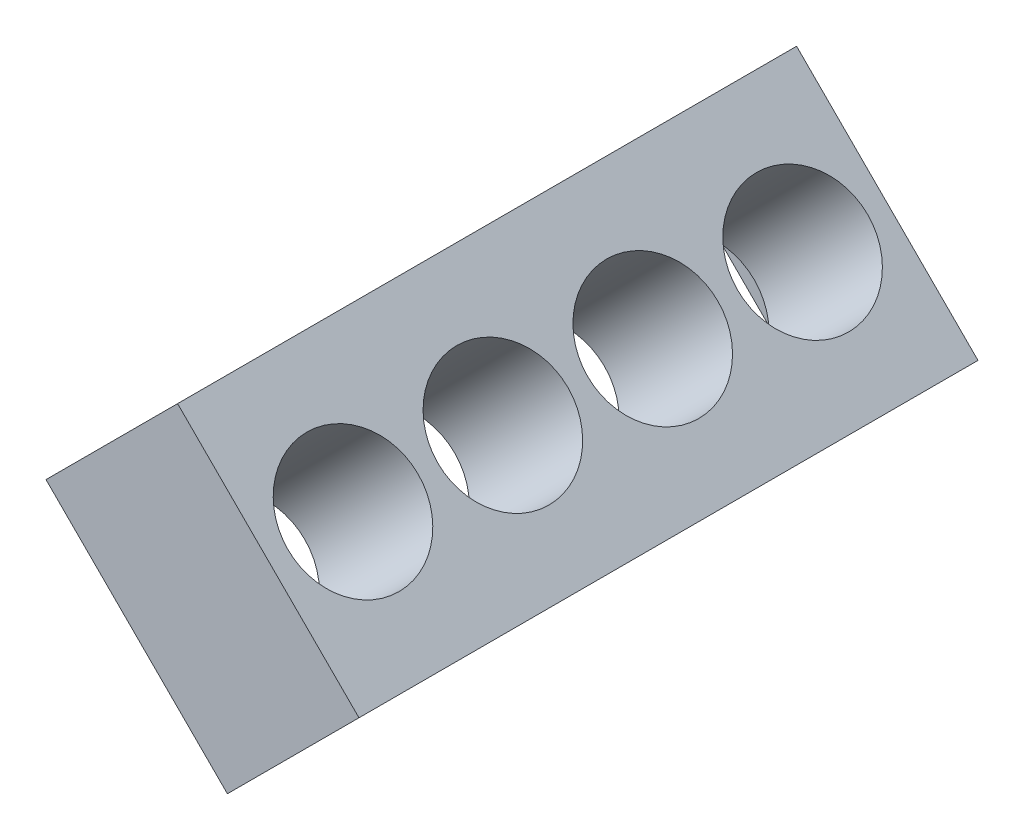
ISO-10303-21;
HEADER;
FILE_DESCRIPTION(('STEP AP214'),'2;1');
FILE_NAME('part.step','',(''),(''),'','','');
FILE_SCHEMA(('AUTOMOTIVE_DESIGN { 1 0 10303 214 1 1 1 1 }'));
ENDSEC;
DATA;
#1=APPLICATION_CONTEXT('core data for automotive mechanical design processes');
#2=APPLICATION_PROTOCOL_DEFINITION('international standard','automotive_design',2000,#1);
#3=PRODUCT_CONTEXT('',#1,'mechanical');
#4=PRODUCT('Part','Part','',(#3));
#5=PRODUCT_RELATED_PRODUCT_CATEGORY('part','',(#4));
#6=PRODUCT_DEFINITION_FORMATION('','',#4);
#7=PRODUCT_DEFINITION_CONTEXT('part definition',#1,'design');
#8=PRODUCT_DEFINITION('design','',#6,#7);
#9=PRODUCT_DEFINITION_SHAPE('','',#8);
#10=(LENGTH_UNIT() NAMED_UNIT(*) SI_UNIT(.MILLI.,.METRE.));
#11=(NAMED_UNIT(*) PLANE_ANGLE_UNIT() SI_UNIT($,.RADIAN.));
#12=(NAMED_UNIT(*) SI_UNIT($,.STERADIAN.) SOLID_ANGLE_UNIT());
#13=UNCERTAINTY_MEASURE_WITH_UNIT(LENGTH_MEASURE(1.E-05),#10,'distance_accuracy_value','');
#14=(GEOMETRIC_REPRESENTATION_CONTEXT(3) GLOBAL_UNCERTAINTY_ASSIGNED_CONTEXT((#13)) GLOBAL_UNIT_ASSIGNED_CONTEXT((#10,
#11,#12)) REPRESENTATION_CONTEXT('',''));
#15=CARTESIAN_POINT('',(0.,0.,0.));
#16=DIRECTION('',(0.,0.,1.));
#17=DIRECTION('',(1.,0.,0.));
#18=AXIS2_PLACEMENT_3D('',#15,#16,#17);
#19=CARTESIAN_POINT('',(69.3244695839903,69.32446958399,0.));
#20=DIRECTION('',(0.707106781186549,0.707106781186546,0.));
#21=DIRECTION('',(0.,0.,-1.));
#22=AXIS2_PLACEMENT_3D('',#19,#20,#21);
#23=PLANE('',#22);
#24=DIRECTION('',(0.707106781186546,-0.707106781186549,0.));
#25=VECTOR('',#24,1.);
#26=CARTESIAN_POINT('',(120.623401772125,18.0255373958555,286.06875));
#27=LINE('',#26,#25);
#28=CARTESIAN_POINT('',(-42.0111579007812,180.660097068762,286.06875));
#29=VERTEX_POINT('',#28);
#30=CARTESIAN_POINT('',(120.623401772124,18.0255373958556,286.06875));
#31=VERTEX_POINT('',#30);
#32=EDGE_CURVE('E301',#29,#31,#27,.T.);
#33=ORIENTED_EDGE('',*,*,#32,.T.);
#34=DIRECTION('',(0.,0.,-1.));
#35=VECTOR('',#34,1.);
#36=CARTESIAN_POINT('',(120.623401772124,18.0255373958556,-297.18125));
#37=LINE('',#36,#35);
#38=CARTESIAN_POINT('',(120.623401772124,18.0255373958556,-297.18125));
#39=VERTEX_POINT('',#38);
#40=EDGE_CURVE('E10',#31,#39,#37,.T.);
#41=ORIENTED_EDGE('',*,*,#40,.T.);
#42=DIRECTION('',(-0.707106781186546,0.707106781186549,0.));
#43=VECTOR('',#42,1.);
#44=CARTESIAN_POINT('',(-42.0111579007812,180.660097068762,-297.18125));
#45=LINE('',#44,#43);
#46=CARTESIAN_POINT('',(-42.0111579007812,180.660097068762,-297.18125));
#47=VERTEX_POINT('',#46);
#48=EDGE_CURVE('E199',#39,#47,#45,.T.);
#49=ORIENTED_EDGE('',*,*,#48,.T.);
#50=DIRECTION('',(0.,0.,1.));
#51=VECTOR('',#50,1.);
#52=CARTESIAN_POINT('',(-42.0111579007812,180.660097068762,286.06875));
#53=LINE('',#52,#51);
#54=EDGE_CURVE('E200',#47,#29,#53,.T.);
#55=ORIENTED_EDGE('',*,*,#54,.T.);
#56=EDGE_LOOP('',(#33,#41,#49,#55));
#57=FACE_BOUND('',#56,.T.);
#58=DIRECTION('',(0.707106781186546,-0.707106781186549,0.));
#59=VECTOR('',#58,1.);
#60=CARTESIAN_POINT('',(127.69446958399,10.9544695839901,-307.18125));
#61=LINE('',#60,#59);
#62=CARTESIAN_POINT('',(-49.0822257126467,187.731164880627,-307.18125));
#63=VERTEX_POINT('',#62);
#64=CARTESIAN_POINT('',(127.69446958399,10.9544695839901,-307.18125));
#65=VERTEX_POINT('',#64);
#66=EDGE_CURVE('E316',#63,#65,#61,.T.);
#67=ORIENTED_EDGE('',*,*,#66,.T.);
#68=DIRECTION('',(0.,0.,1.));
#69=VECTOR('',#68,1.);
#70=CARTESIAN_POINT('',(127.69446958399,10.9544695839901,296.06875));
#71=LINE('',#70,#69);
#72=CARTESIAN_POINT('',(127.69446958399,10.9544695839901,296.06875));
#73=VERTEX_POINT('',#72);
#74=EDGE_CURVE('E205',#65,#73,#71,.T.);
#75=ORIENTED_EDGE('',*,*,#74,.T.);
#76=DIRECTION('',(-0.707106781186547,0.707106781186549,0.));
#77=VECTOR('',#76,1.);
#78=CARTESIAN_POINT('',(-49.0822257126467,187.731164880627,296.06875));
#79=LINE('',#78,#77);
#80=CARTESIAN_POINT('',(-49.0822257126467,187.731164880627,296.06875));
#81=VERTEX_POINT('',#80);
#82=EDGE_CURVE('E214',#73,#81,#79,.T.);
#83=ORIENTED_EDGE('',*,*,#82,.T.);
#84=DIRECTION('',(0.,0.,-1.));
#85=VECTOR('',#84,1.);
#86=CARTESIAN_POINT('',(-49.0822257126467,187.731164880627,-307.18125));
#87=LINE('',#86,#85);
#88=EDGE_CURVE('E270',#81,#63,#87,.T.);
#89=ORIENTED_EDGE('',*,*,#88,.T.);
#90=EDGE_LOOP('',(#67,#75,#83,#89));
#91=FACE_BOUND('',#90,.T.);
#92=ADVANCED_FACE('F15',(#57,#91),#23,.F.);
#93=CARTESIAN_POINT('',(51.2989321881343,-51.2989321881344,-297.18125));
#94=DIRECTION('',(-0.707106781186547,0.707106781186549,0.));
#95=DIRECTION('',(0.,0.,1.));
#96=AXIS2_PLACEMENT_3D('',#93,#94,#95);
#97=PLANE('',#96);
#98=ORIENTED_EDGE('',*,*,#40,.F.);
#99=DIRECTION('',(0.707106781186549,0.707106781186547,0.));
#100=VECTOR('',#99,1.);
#101=CARTESIAN_POINT('',(51.2989321881343,-51.2989321881344,286.06875));
#102=LINE('',#101,#100);
#103=CARTESIAN_POINT('',(138.453932189105,35.8560678128363,286.06875));
#104=VERTEX_POINT('',#103);
#105=EDGE_CURVE('E300',#31,#104,#102,.T.);
#106=ORIENTED_EDGE('',*,*,#105,.T.);
#107=DIRECTION('',(0.,0.,1.));
#108=VECTOR('',#107,1.);
#109=CARTESIAN_POINT('',(138.453932189105,35.8560678128363,-297.18125));
#110=LINE('',#109,#108);
#111=CARTESIAN_POINT('',(138.453932189105,35.8560678128363,-297.18125));
#112=VERTEX_POINT('',#111);
#113=EDGE_CURVE('E264',#112,#104,#110,.T.);
#114=ORIENTED_EDGE('',*,*,#113,.F.);
#115=DIRECTION('',(0.707106781186549,0.707106781186547,0.));
#116=VECTOR('',#115,1.);
#117=CARTESIAN_POINT('',(51.2989321881343,-51.2989321881344,-297.18125));
#118=LINE('',#117,#116);
#119=EDGE_CURVE('E26',#39,#112,#118,.T.);
#120=ORIENTED_EDGE('',*,*,#119,.F.);
#121=EDGE_LOOP('',(#98,#106,#114,#120));
#122=FACE_BOUND('',#121,.T.);
#123=ADVANCED_FACE('F357',(#122),#97,.T.);
#124=CARTESIAN_POINT('',(-111.335627484771,111.335627484772,-297.18125));
#125=DIRECTION('',(0.,0.,1.));
#126=DIRECTION('',(1.,0.,0.));
#127=AXIS2_PLACEMENT_3D('',#124,#125,#126);
#128=PLANE('',#127);
#129=ORIENTED_EDGE('',*,*,#48,.F.);
#130=ORIENTED_EDGE('',*,*,#119,.T.);
#131=DIRECTION('',(0.707106781186547,-0.707106781186549,0.));
#132=VECTOR('',#131,1.);
#133=CARTESIAN_POINT('',(-24.1806274838006,198.490627485742,-297.18125));
#134=LINE('',#133,#132);
#135=CARTESIAN_POINT('',(-24.1806274838006,198.490627485742,-297.18125));
#136=VERTEX_POINT('',#135);
#137=EDGE_CURVE('E319',#136,#112,#134,.T.);
#138=ORIENTED_EDGE('',*,*,#137,.F.);
#139=DIRECTION('',(0.707106781186549,0.707106781186547,0.));
#140=VECTOR('',#139,1.);
#141=CARTESIAN_POINT('',(-111.335627484771,111.335627484772,-297.18125));
#142=LINE('',#141,#140);
#143=EDGE_CURVE('E196',#47,#136,#142,.T.);
#144=ORIENTED_EDGE('',*,*,#143,.F.);
#145=EDGE_LOOP('',(#129,#130,#138,#144));
#146=FACE_BOUND('',#145,.T.);
#147=ADVANCED_FACE('F358',(#146),#128,.T.);
#148=CARTESIAN_POINT('',(-111.335627484771,111.335627484772,286.06875));
#149=DIRECTION('',(0.707106781186547,-0.707106781186549,0.));
#150=DIRECTION('',(0.,0.,-1.));
#151=AXIS2_PLACEMENT_3D('',#148,#149,#150);
#152=PLANE('',#151);
#153=ORIENTED_EDGE('',*,*,#54,.F.);
#154=ORIENTED_EDGE('',*,*,#143,.T.);
#155=DIRECTION('',(0.,0.,-1.));
#156=VECTOR('',#155,1.);
#157=CARTESIAN_POINT('',(-24.1806274838006,198.490627485742,286.06875));
#158=LINE('',#157,#156);
#159=CARTESIAN_POINT('',(-24.1806274838006,198.490627485742,286.06875));
#160=VERTEX_POINT('',#159);
#161=EDGE_CURVE('E263',#160,#136,#158,.T.);
#162=ORIENTED_EDGE('',*,*,#161,.F.);
#163=DIRECTION('',(0.707106781186549,0.707106781186547,0.));
#164=VECTOR('',#163,1.);
#165=CARTESIAN_POINT('',(-111.335627484771,111.335627484772,286.06875));
#166=LINE('',#165,#164);
#167=EDGE_CURVE('E297',#29,#160,#166,.T.);
#168=ORIENTED_EDGE('',*,*,#167,.F.);
#169=EDGE_LOOP('',(#153,#154,#162,#168));
#170=FACE_BOUND('',#169,.T.);
#171=ADVANCED_FACE('F332',(#170),#152,.T.);
#172=CARTESIAN_POINT('',(51.2989321881343,-51.2989321881344,286.06875));
#173=DIRECTION('',(0.,0.,-1.));
#174=DIRECTION('',(0.,-1.,0.));
#175=AXIS2_PLACEMENT_3D('',#172,#173,#174);
#176=PLANE('',#175);
#177=ORIENTED_EDGE('',*,*,#32,.F.);
#178=ORIENTED_EDGE('',*,*,#167,.T.);
#179=DIRECTION('',(-0.707106781186547,0.707106781186549,0.));
#180=VECTOR('',#179,1.);
#181=CARTESIAN_POINT('',(138.453932189105,35.8560678128363,286.06875));
#182=LINE('',#181,#180);
#183=EDGE_CURVE('E259',#104,#160,#182,.T.);
#184=ORIENTED_EDGE('',*,*,#183,.F.);
#185=ORIENTED_EDGE('',*,*,#105,.F.);
#186=EDGE_LOOP('',(#177,#178,#184,#185));
#187=FACE_BOUND('',#186,.T.);
#188=ADVANCED_FACE('F17',(#187),#176,.T.);
#189=CARTESIAN_POINT('',(0.,0.,-307.18125));
#190=DIRECTION('',(0.,0.,-1.));
#191=DIRECTION('',(0.,-1.,0.));
#192=AXIS2_PLACEMENT_3D('',#189,#190,#191);
#193=PLANE('',#192);
#194=ORIENTED_EDGE('',*,*,#66,.F.);
#195=DIRECTION('',(0.707106781186549,0.707106781186546,0.));
#196=VECTOR('',#195,1.);
#197=CARTESIAN_POINT('',(-31.251695295666,205.561695297608,-307.18125));
#198=LINE('',#197,#196);
#199=CARTESIAN_POINT('',(79.1589393668847,315.972329960159,-307.18125));
#200=VERTEX_POINT('',#199);
#201=EDGE_CURVE('E226',#63,#200,#198,.T.);
#202=ORIENTED_EDGE('',*,*,#201,.T.);
#203=DIRECTION('',(0.707106781186546,-0.707106781186549,0.));
#204=VECTOR('',#203,1.);
#205=CARTESIAN_POINT('',(79.1589393668847,315.972329960159,-307.18125));
#206=LINE('',#205,#204);
#207=CARTESIAN_POINT('',(255.935634663522,139.195634663521,-307.18125));
#208=VERTEX_POINT('',#207);
#209=EDGE_CURVE('E236',#200,#208,#206,.T.);
#210=ORIENTED_EDGE('',*,*,#209,.T.);
#211=DIRECTION('',(-0.707106781186549,-0.707106781186547,0.));
#212=VECTOR('',#211,1.);
#213=CARTESIAN_POINT('',(255.935634663522,139.195634663521,-307.18125));
#214=LINE('',#213,#212);
#215=EDGE_CURVE('E208',#208,#65,#214,.T.);
#216=ORIENTED_EDGE('',*,*,#215,.T.);
#217=EDGE_LOOP('',(#194,#202,#210,#216));
#218=FACE_BOUND('',#217,.T.);
#219=ADVANCED_FACE('F402',(#218),#193,.T.);
#220=CARTESIAN_POINT('',(87.1550000009709,87.1550000009707,0.));
#221=DIRECTION('',(0.707106781186549,0.707106781186547,0.));
#222=DIRECTION('',(0.,0.,-1.));
#223=AXIS2_PLACEMENT_3D('',#220,#221,#222);
#224=PLANE('',#223);
#225=CARTESIAN_POINT('',(57.1366523526523,117.173347649289,-224.63125));
#226=DIRECTION('',(-0.707106781186549,-0.707106781186547,0.));
#227=DIRECTION('',(-0.707106781186547,0.707106781186549,0.));
#228=AXIS2_PLACEMENT_3D('',#225,#226,#227);
#229=CIRCLE('',#228,63.5);
#230=CARTESIAN_POINT('',(12.2353717473066,162.074628254635,-224.63125));
#231=VERTEX_POINT('',#230);
#232=CARTESIAN_POINT('',(102.037932957998,72.2720670439435,-224.63125));
#233=VERTEX_POINT('',#232);
#234=EDGE_CURVE('E282',#231,#233,#229,.T.);
#235=ORIENTED_EDGE('',*,*,#234,.F.);
#236=CARTESIAN_POINT('',(57.1366523526523,117.173347649289,-224.63125));
#237=DIRECTION('',(-0.707106781186549,-0.707106781186547,0.));
#238=DIRECTION('',(-0.707106781186547,0.707106781186549,0.));
#239=AXIS2_PLACEMENT_3D('',#236,#237,#238);
#240=CIRCLE('',#239,63.5);
#241=EDGE_CURVE('E258',#233,#231,#240,.T.);
#242=ORIENTED_EDGE('',*,*,#241,.F.);
#243=EDGE_LOOP('',(#235,#242));
#244=FACE_BOUND('',#243,.T.);
#245=CARTESIAN_POINT('',(57.1366523526524,117.173347649289,67.46875));
#246=DIRECTION('',(-0.707106781186549,-0.707106781186547,0.));
#247=DIRECTION('',(-0.707106781186547,0.707106781186549,0.));
#248=AXIS2_PLACEMENT_3D('',#245,#246,#247);
#249=CIRCLE('',#248,63.5);
#250=CARTESIAN_POINT('',(12.2353717473067,162.074628254635,67.46875));
#251=VERTEX_POINT('',#250);
#252=CARTESIAN_POINT('',(102.037932957998,72.2720670439435,67.46875));
#253=VERTEX_POINT('',#252);
#254=EDGE_CURVE('E182',#251,#253,#249,.T.);
#255=ORIENTED_EDGE('',*,*,#254,.F.);
#256=CARTESIAN_POINT('',(57.1366523526524,117.173347649289,67.46875));
#257=DIRECTION('',(-0.707106781186549,-0.707106781186547,0.));
#258=DIRECTION('',(-0.707106781186547,0.707106781186549,0.));
#259=AXIS2_PLACEMENT_3D('',#256,#257,#258);
#260=CIRCLE('',#259,63.5);
#261=EDGE_CURVE('E257',#253,#251,#260,.T.);
#262=ORIENTED_EDGE('',*,*,#261,.F.);
#263=EDGE_LOOP('',(#255,#262));
#264=FACE_BOUND('',#263,.T.);
#265=CARTESIAN_POINT('',(57.1366523526524,117.173347649289,213.51875));
#266=DIRECTION('',(-0.707106781186549,-0.707106781186547,0.));
#267=DIRECTION('',(-0.707106781186547,0.707106781186549,0.));
#268=AXIS2_PLACEMENT_3D('',#265,#266,#267);
#269=CIRCLE('',#268,63.5);
#270=CARTESIAN_POINT('',(12.2353717473067,162.074628254635,213.51875));
#271=VERTEX_POINT('',#270);
#272=CARTESIAN_POINT('',(102.037932957998,72.2720670439435,213.51875));
#273=VERTEX_POINT('',#272);
#274=EDGE_CURVE('E192',#271,#273,#269,.T.);
#275=ORIENTED_EDGE('',*,*,#274,.F.);
#276=CARTESIAN_POINT('',(57.1366523526524,117.173347649289,213.51875));
#277=DIRECTION('',(-0.707106781186549,-0.707106781186547,0.));
#278=DIRECTION('',(-0.707106781186547,0.707106781186549,0.));
#279=AXIS2_PLACEMENT_3D('',#276,#277,#278);
#280=CIRCLE('',#279,63.5);
#281=EDGE_CURVE('E177',#273,#271,#280,.T.);
#282=ORIENTED_EDGE('',*,*,#281,.F.);
#283=EDGE_LOOP('',(#275,#282));
#284=FACE_BOUND('',#283,.T.);
#285=CARTESIAN_POINT('',(57.1366523526523,117.173347649289,-78.58125));
#286=DIRECTION('',(-0.707106781186549,-0.707106781186547,0.));
#287=DIRECTION('',(-0.707106781186547,0.707106781186549,0.));
#288=AXIS2_PLACEMENT_3D('',#285,#286,#287);
#289=CIRCLE('',#288,63.5);
#290=CARTESIAN_POINT('',(12.2353717473066,162.074628254635,-78.58125));
#291=VERTEX_POINT('',#290);
#292=CARTESIAN_POINT('',(102.037932957998,72.2720670439435,-78.58125));
#293=VERTEX_POINT('',#292);
#294=EDGE_CURVE('E237',#291,#293,#289,.T.);
#295=ORIENTED_EDGE('',*,*,#294,.F.);
#296=CARTESIAN_POINT('',(57.1366523526523,117.173347649289,-78.58125));
#297=DIRECTION('',(-0.707106781186549,-0.707106781186547,0.));
#298=DIRECTION('',(-0.707106781186547,0.707106781186549,0.));
#299=AXIS2_PLACEMENT_3D('',#296,#297,#298);
#300=CIRCLE('',#299,63.5);
#301=EDGE_CURVE('E254',#293,#291,#300,.T.);
#302=ORIENTED_EDGE('',*,*,#301,.F.);
#303=EDGE_LOOP('',(#295,#302));
#304=FACE_BOUND('',#303,.T.);
#305=ORIENTED_EDGE('',*,*,#113,.T.);
#306=ORIENTED_EDGE('',*,*,#183,.T.);
#307=ORIENTED_EDGE('',*,*,#161,.T.);
#308=ORIENTED_EDGE('',*,*,#137,.T.);
#309=EDGE_LOOP('',(#305,#306,#307,#308));
#310=FACE_BOUND('',#309,.T.);
#311=ADVANCED_FACE('F354',(#244,#264,#284,#304,#310),#224,.F.);
#312=CARTESIAN_POINT('',(-68.4250429449558,-8.38834764831842,213.51875));
#313=DIRECTION('',(0.707106781186549,0.707106781186546,0.));
#314=DIRECTION('',(-0.707106781186546,0.707106781186549,0.));
#315=AXIS2_PLACEMENT_3D('',#312,#313,#314);
#316=CYLINDRICAL_SURFACE('',#315,63.5);
#317=DIRECTION('',(0.707106781186549,0.707106781186546,0.));
#318=VECTOR('',#317,1.);
#319=CARTESIAN_POINT('',(-23.5237623396101,-53.2896282536643,213.51875));
#320=LINE('',#319,#318);
#321=CARTESIAN_POINT('',(212.448567620549,182.682701706494,213.51875));
#322=VERTEX_POINT('',#321);
#323=EDGE_CURVE('E185',#273,#322,#320,.T.);
#324=ORIENTED_EDGE('',*,*,#323,.F.);
#325=ORIENTED_EDGE('',*,*,#281,.T.);
#326=DIRECTION('',(0.707106781186549,0.707106781186546,0.));
#327=VECTOR('',#326,1.);
#328=CARTESIAN_POINT('',(-113.326323550301,36.5129329570275,213.51875));
#329=LINE('',#328,#327);
#330=CARTESIAN_POINT('',(122.646006409857,272.485262917185,213.51875));
#331=VERTEX_POINT('',#330);
#332=EDGE_CURVE('E175',#271,#331,#329,.T.);
#333=ORIENTED_EDGE('',*,*,#332,.T.);
#334=CARTESIAN_POINT('',(167.547287015203,227.58398231184,213.51875));
#335=DIRECTION('',(0.707106781186549,0.707106781186547,0.));
#336=DIRECTION('',(-0.707106781186546,0.707106781186549,0.));
#337=AXIS2_PLACEMENT_3D('',#334,#335,#336);
#338=CIRCLE('',#337,63.5);
#339=EDGE_CURVE('E161',#331,#322,#338,.T.);
#340=ORIENTED_EDGE('',*,*,#339,.T.);
#341=EDGE_LOOP('',(#324,#325,#333,#340));
#342=FACE_BOUND('',#341,.T.);
#343=ADVANCED_FACE('F176',(#342),#316,.F.);
#344=CARTESIAN_POINT('',(-68.4250429449559,-8.3883476483185,67.46875));
#345=DIRECTION('',(0.707106781186549,0.707106781186546,0.));
#346=DIRECTION('',(-0.707106781186546,0.707106781186549,0.));
#347=AXIS2_PLACEMENT_3D('',#344,#345,#346);
#348=CYLINDRICAL_SURFACE('',#347,63.5);
#349=DIRECTION('',(0.707106781186549,0.707106781186546,0.));
#350=VECTOR('',#349,1.);
#351=CARTESIAN_POINT('',(-23.5237623396103,-53.2896282536644,67.46875));
#352=LINE('',#351,#350);
#353=CARTESIAN_POINT('',(212.448567620549,182.682701706494,67.46875));
#354=VERTEX_POINT('',#353);
#355=EDGE_CURVE('E203',#253,#354,#352,.T.);
#356=ORIENTED_EDGE('',*,*,#355,.F.);
#357=ORIENTED_EDGE('',*,*,#261,.T.);
#358=DIRECTION('',(0.707106781186549,0.707106781186546,0.));
#359=VECTOR('',#358,1.);
#360=CARTESIAN_POINT('',(-113.326323550302,36.5129329570274,67.46875));
#361=LINE('',#360,#359);
#362=CARTESIAN_POINT('',(122.646006409857,272.485262917185,67.46875));
#363=VERTEX_POINT('',#362);
#364=EDGE_CURVE('E231',#251,#363,#361,.T.);
#365=ORIENTED_EDGE('',*,*,#364,.T.);
#366=CARTESIAN_POINT('',(167.547287015203,227.583982311839,67.46875));
#367=DIRECTION('',(0.707106781186549,0.707106781186546,0.));
#368=DIRECTION('',(-0.707106781186546,0.707106781186549,0.));
#369=AXIS2_PLACEMENT_3D('',#366,#367,#368);
#370=CIRCLE('',#369,63.5);
#371=EDGE_CURVE('E171',#363,#354,#370,.T.);
#372=ORIENTED_EDGE('',*,*,#371,.T.);
#373=EDGE_LOOP('',(#356,#357,#365,#372));
#374=FACE_BOUND('',#373,.T.);
#375=ADVANCED_FACE('F397',(#374),#348,.F.);
#376=CARTESIAN_POINT('',(-68.4250429449559,-8.38834764831839,-78.58125));
#377=DIRECTION('',(0.707106781186549,0.707106781186546,0.));
#378=DIRECTION('',(-0.707106781186546,0.707106781186549,0.));
#379=AXIS2_PLACEMENT_3D('',#376,#377,#378);
#380=CYLINDRICAL_SURFACE('',#379,63.5);
#381=DIRECTION('',(0.707106781186549,0.707106781186546,0.));
#382=VECTOR('',#381,1.);
#383=CARTESIAN_POINT('',(-23.5237623396101,-53.2896282536643,-78.58125));
#384=LINE('',#383,#382);
#385=CARTESIAN_POINT('',(212.448567620549,182.682701706494,-78.58125));
#386=VERTEX_POINT('',#385);
#387=EDGE_CURVE('E241',#293,#386,#384,.T.);
#388=ORIENTED_EDGE('',*,*,#387,.F.);
#389=ORIENTED_EDGE('',*,*,#301,.T.);
#390=DIRECTION('',(0.707106781186549,0.707106781186546,0.));
#391=VECTOR('',#390,1.);
#392=CARTESIAN_POINT('',(-113.326323550302,36.5129329570275,-78.58125));
#393=LINE('',#392,#391);
#394=CARTESIAN_POINT('',(122.646006409857,272.485262917185,-78.58125));
#395=VERTEX_POINT('',#394);
#396=EDGE_CURVE('E278',#291,#395,#393,.T.);
#397=ORIENTED_EDGE('',*,*,#396,.T.);
#398=CARTESIAN_POINT('',(167.547287015203,227.58398231184,-78.58125));
#399=DIRECTION('',(0.707106781186549,0.707106781186546,0.));
#400=DIRECTION('',(-0.707106781186546,0.707106781186549,0.));
#401=AXIS2_PLACEMENT_3D('',#398,#399,#400);
#402=CIRCLE('',#401,63.5);
#403=EDGE_CURVE('E227',#395,#386,#402,.T.);
#404=ORIENTED_EDGE('',*,*,#403,.T.);
#405=EDGE_LOOP('',(#388,#389,#397,#404));
#406=FACE_BOUND('',#405,.T.);
#407=ADVANCED_FACE('F379',(#406),#380,.F.);
#408=CARTESIAN_POINT('',(-68.4250429449559,-8.38834764831842,-224.63125));
#409=DIRECTION('',(0.707106781186549,0.707106781186546,0.));
#410=DIRECTION('',(-0.707106781186546,0.707106781186549,0.));
#411=AXIS2_PLACEMENT_3D('',#408,#409,#410);
#412=CYLINDRICAL_SURFACE('',#411,63.5);
#413=DIRECTION('',(0.707106781186549,0.707106781186546,0.));
#414=VECTOR('',#413,1.);
#415=CARTESIAN_POINT('',(-23.5237623396102,-53.2896282536643,-224.63125));
#416=LINE('',#415,#414);
#417=CARTESIAN_POINT('',(212.448567620549,182.682701706494,-224.63125));
#418=VERTEX_POINT('',#417);
#419=EDGE_CURVE('E253',#233,#418,#416,.T.);
#420=ORIENTED_EDGE('',*,*,#419,.F.);
#421=ORIENTED_EDGE('',*,*,#241,.T.);
#422=DIRECTION('',(0.707106781186549,0.707106781186546,0.));
#423=VECTOR('',#422,1.);
#424=CARTESIAN_POINT('',(-113.326323550302,36.5129329570275,-224.63125));
#425=LINE('',#424,#423);
#426=CARTESIAN_POINT('',(122.646006409857,272.485262917185,-224.63125));
#427=VERTEX_POINT('',#426);
#428=EDGE_CURVE('E215',#231,#427,#425,.T.);
#429=ORIENTED_EDGE('',*,*,#428,.T.);
#430=CARTESIAN_POINT('',(167.547287015203,227.58398231184,-224.63125));
#431=DIRECTION('',(0.707106781186549,0.707106781186547,0.));
#432=DIRECTION('',(-0.707106781186546,0.707106781186549,0.));
#433=AXIS2_PLACEMENT_3D('',#430,#431,#432);
#434=CIRCLE('',#433,63.5);
#435=EDGE_CURVE('E223',#427,#418,#434,.T.);
#436=ORIENTED_EDGE('',*,*,#435,.T.);
#437=EDGE_LOOP('',(#420,#421,#429,#436));
#438=FACE_BOUND('',#437,.T.);
#439=ADVANCED_FACE('F375',(#438),#412,.F.);
#440=CARTESIAN_POINT('',(-76.8133905932741,160.,296.06875));
#441=DIRECTION('',(0.707106781186546,-0.707106781186549,0.));
#442=DIRECTION('',(0.,0.,-1.));
#443=AXIS2_PLACEMENT_3D('',#440,#441,#442);
#444=PLANE('',#443);
#445=ORIENTED_EDGE('',*,*,#201,.F.);
#446=ORIENTED_EDGE('',*,*,#88,.F.);
#447=DIRECTION('',(-0.707106781186549,-0.707106781186546,0.));
#448=VECTOR('',#447,1.);
#449=CARTESIAN_POINT('',(-76.8133905932741,160.,296.06875));
#450=LINE('',#449,#448);
#451=CARTESIAN_POINT('',(79.1589393668848,315.972329960159,296.06875));
#452=VERTEX_POINT('',#451);
#453=EDGE_CURVE('E210',#452,#81,#450,.T.);
#454=ORIENTED_EDGE('',*,*,#453,.F.);
#455=DIRECTION('',(0.,0.,-1.));
#456=VECTOR('',#455,1.);
#457=CARTESIAN_POINT('',(79.1589393668848,315.972329960159,296.06875));
#458=LINE('',#457,#456);
#459=EDGE_CURVE('E172',#452,#200,#458,.T.);
#460=ORIENTED_EDGE('',*,*,#459,.T.);
#461=EDGE_LOOP('',(#445,#446,#454,#460));
#462=FACE_BOUND('',#461,.T.);
#463=ADVANCED_FACE('F378',(#462),#444,.F.);
#464=CARTESIAN_POINT('',(79.1589393668848,315.972329960159,296.06875));
#465=DIRECTION('',(-0.707106781186549,-0.707106781186546,0.));
#466=DIRECTION('',(-0.707106781186546,0.707106781186549,0.));
#467=AXIS2_PLACEMENT_3D('',#464,#465,#466);
#468=PLANE('',#467);
#469=ORIENTED_EDGE('',*,*,#435,.F.);
#470=CARTESIAN_POINT('',(167.547287015203,227.58398231184,-224.63125));
#471=DIRECTION('',(0.707106781186549,0.707106781186547,0.));
#472=DIRECTION('',(-0.707106781186546,0.707106781186549,0.));
#473=AXIS2_PLACEMENT_3D('',#470,#471,#472);
#474=CIRCLE('',#473,63.5);
#475=EDGE_CURVE('E219',#418,#427,#474,.T.);
#476=ORIENTED_EDGE('',*,*,#475,.F.);
#477=EDGE_LOOP('',(#469,#476));
#478=FACE_BOUND('',#477,.T.);
#479=ORIENTED_EDGE('',*,*,#403,.F.);
#480=CARTESIAN_POINT('',(167.547287015203,227.58398231184,-78.58125));
#481=DIRECTION('',(0.707106781186549,0.707106781186546,0.));
#482=DIRECTION('',(-0.707106781186546,0.707106781186549,0.));
#483=AXIS2_PLACEMENT_3D('',#480,#481,#482);
#484=CIRCLE('',#483,63.5);
#485=EDGE_CURVE('E283',#386,#395,#484,.T.);
#486=ORIENTED_EDGE('',*,*,#485,.F.);
#487=EDGE_LOOP('',(#479,#486));
#488=FACE_BOUND('',#487,.T.);
#489=ORIENTED_EDGE('',*,*,#371,.F.);
#490=CARTESIAN_POINT('',(167.547287015203,227.583982311839,67.46875));
#491=DIRECTION('',(0.707106781186549,0.707106781186546,0.));
#492=DIRECTION('',(-0.707106781186546,0.707106781186549,0.));
#493=AXIS2_PLACEMENT_3D('',#490,#491,#492);
#494=CIRCLE('',#493,63.5);
#495=EDGE_CURVE('E228',#354,#363,#494,.T.);
#496=ORIENTED_EDGE('',*,*,#495,.F.);
#497=EDGE_LOOP('',(#489,#496));
#498=FACE_BOUND('',#497,.T.);
#499=ORIENTED_EDGE('',*,*,#339,.F.);
#500=CARTESIAN_POINT('',(167.547287015203,227.58398231184,213.51875));
#501=DIRECTION('',(0.707106781186549,0.707106781186547,0.));
#502=DIRECTION('',(-0.707106781186546,0.707106781186549,0.));
#503=AXIS2_PLACEMENT_3D('',#500,#501,#502);
#504=CIRCLE('',#503,63.5);
#505=EDGE_CURVE('E166',#322,#331,#504,.T.);
#506=ORIENTED_EDGE('',*,*,#505,.F.);
#507=EDGE_LOOP('',(#499,#506));
#508=FACE_BOUND('',#507,.T.);
#509=DIRECTION('',(0.,0.,-1.));
#510=VECTOR('',#509,1.);
#511=CARTESIAN_POINT('',(255.935634663522,139.195634663521,296.06875));
#512=LINE('',#511,#510);
#513=CARTESIAN_POINT('',(255.935634663522,139.195634663521,296.06875));
#514=VERTEX_POINT('',#513);
#515=EDGE_CURVE('E249',#514,#208,#512,.T.);
#516=ORIENTED_EDGE('',*,*,#515,.T.);
#517=ORIENTED_EDGE('',*,*,#209,.F.);
#518=ORIENTED_EDGE('',*,*,#459,.F.);
#519=DIRECTION('',(-0.707106781186546,0.707106781186549,0.));
#520=VECTOR('',#519,1.);
#521=CARTESIAN_POINT('',(79.1589393668848,315.972329960159,296.06875));
#522=LINE('',#521,#520);
#523=EDGE_CURVE('E209',#514,#452,#522,.T.);
#524=ORIENTED_EDGE('',*,*,#523,.F.);
#525=EDGE_LOOP('',(#516,#517,#518,#524));
#526=FACE_BOUND('',#525,.T.);
#527=ADVANCED_FACE('F163',(#478,#488,#498,#508,#526),#468,.F.);
#528=CARTESIAN_POINT('',(255.935634663522,139.195634663521,296.06875));
#529=DIRECTION('',(-0.707106781186547,0.707106781186549,0.));
#530=DIRECTION('',(0.,0.,1.));
#531=AXIS2_PLACEMENT_3D('',#528,#529,#530);
#532=PLANE('',#531);
#533=DIRECTION('',(0.707106781186549,0.707106781186547,0.));
#534=VECTOR('',#533,1.);
#535=CARTESIAN_POINT('',(255.935634663522,139.195634663521,296.06875));
#536=LINE('',#535,#534);
#537=EDGE_CURVE('E19',#73,#514,#536,.T.);
#538=ORIENTED_EDGE('',*,*,#537,.F.);
#539=ORIENTED_EDGE('',*,*,#74,.F.);
#540=ORIENTED_EDGE('',*,*,#215,.F.);
#541=ORIENTED_EDGE('',*,*,#515,.F.);
#542=EDGE_LOOP('',(#538,#539,#540,#541));
#543=FACE_BOUND('',#542,.T.);
#544=ADVANCED_FACE('F390',(#543),#532,.F.);
#545=CARTESIAN_POINT('',(0.,0.,296.06875));
#546=DIRECTION('',(0.,0.,-1.));
#547=DIRECTION('',(0.,-1.,0.));
#548=AXIS2_PLACEMENT_3D('',#545,#546,#547);
#549=PLANE('',#548);
#550=ORIENTED_EDGE('',*,*,#453,.T.);
#551=ORIENTED_EDGE('',*,*,#82,.F.);
#552=ORIENTED_EDGE('',*,*,#537,.T.);
#553=ORIENTED_EDGE('',*,*,#523,.T.);
#554=EDGE_LOOP('',(#550,#551,#552,#553));
#555=FACE_BOUND('',#554,.T.);
#556=ADVANCED_FACE('F393',(#555),#549,.F.);
#557=CARTESIAN_POINT('',(-68.4250429449559,-8.38834764831842,-224.63125));
#558=DIRECTION('',(0.707106781186549,0.707106781186546,0.));
#559=DIRECTION('',(-0.707106781186546,0.707106781186549,0.));
#560=AXIS2_PLACEMENT_3D('',#557,#558,#559);
#561=CYLINDRICAL_SURFACE('',#560,63.5);
#562=ORIENTED_EDGE('',*,*,#234,.T.);
#563=ORIENTED_EDGE('',*,*,#419,.T.);
#564=ORIENTED_EDGE('',*,*,#475,.T.);
#565=ORIENTED_EDGE('',*,*,#428,.F.);
#566=EDGE_LOOP('',(#562,#563,#564,#565));
#567=FACE_BOUND('',#566,.T.);
#568=ADVANCED_FACE('F388',(#567),#561,.F.);
#569=CARTESIAN_POINT('',(-68.4250429449559,-8.38834764831839,-78.58125));
#570=DIRECTION('',(0.707106781186549,0.707106781186546,0.));
#571=DIRECTION('',(-0.707106781186546,0.707106781186549,0.));
#572=AXIS2_PLACEMENT_3D('',#569,#570,#571);
#573=CYLINDRICAL_SURFACE('',#572,63.5);
#574=ORIENTED_EDGE('',*,*,#294,.T.);
#575=ORIENTED_EDGE('',*,*,#387,.T.);
#576=ORIENTED_EDGE('',*,*,#485,.T.);
#577=ORIENTED_EDGE('',*,*,#396,.F.);
#578=EDGE_LOOP('',(#574,#575,#576,#577));
#579=FACE_BOUND('',#578,.T.);
#580=ADVANCED_FACE('F384',(#579),#573,.F.);
#581=CARTESIAN_POINT('',(-68.4250429449559,-8.3883476483185,67.46875));
#582=DIRECTION('',(0.707106781186549,0.707106781186546,0.));
#583=DIRECTION('',(-0.707106781186546,0.707106781186549,0.));
#584=AXIS2_PLACEMENT_3D('',#581,#582,#583);
#585=CYLINDRICAL_SURFACE('',#584,63.5);
#586=ORIENTED_EDGE('',*,*,#254,.T.);
#587=ORIENTED_EDGE('',*,*,#355,.T.);
#588=ORIENTED_EDGE('',*,*,#495,.T.);
#589=ORIENTED_EDGE('',*,*,#364,.F.);
#590=EDGE_LOOP('',(#586,#587,#588,#589));
#591=FACE_BOUND('',#590,.T.);
#592=ADVANCED_FACE('F387',(#591),#585,.F.);
#593=CARTESIAN_POINT('',(-68.4250429449558,-8.38834764831842,213.51875));
#594=DIRECTION('',(0.707106781186549,0.707106781186546,0.));
#595=DIRECTION('',(-0.707106781186546,0.707106781186549,0.));
#596=AXIS2_PLACEMENT_3D('',#593,#594,#595);
#597=CYLINDRICAL_SURFACE('',#596,63.5);
#598=ORIENTED_EDGE('',*,*,#274,.T.);
#599=ORIENTED_EDGE('',*,*,#323,.T.);
#600=ORIENTED_EDGE('',*,*,#505,.T.);
#601=ORIENTED_EDGE('',*,*,#332,.F.);
#602=EDGE_LOOP('',(#598,#599,#600,#601));
#603=FACE_BOUND('',#602,.T.);
#604=ADVANCED_FACE('F184',(#603),#597,.F.);
#605=CLOSED_SHELL('',(#92,#123,#147,#171,#188,#219,#311,#343,#375,#407,#439,#463,#527,#544,#556,
#568,#580,#592,#604));
#606=MANIFOLD_SOLID_BREP('B1',#605);
#607=ADVANCED_BREP_SHAPE_REPRESENTATION('',(#18,#606),#14);
#608=SHAPE_DEFINITION_REPRESENTATION(#9,#607);
ENDSEC;
END-ISO-10303-21;
